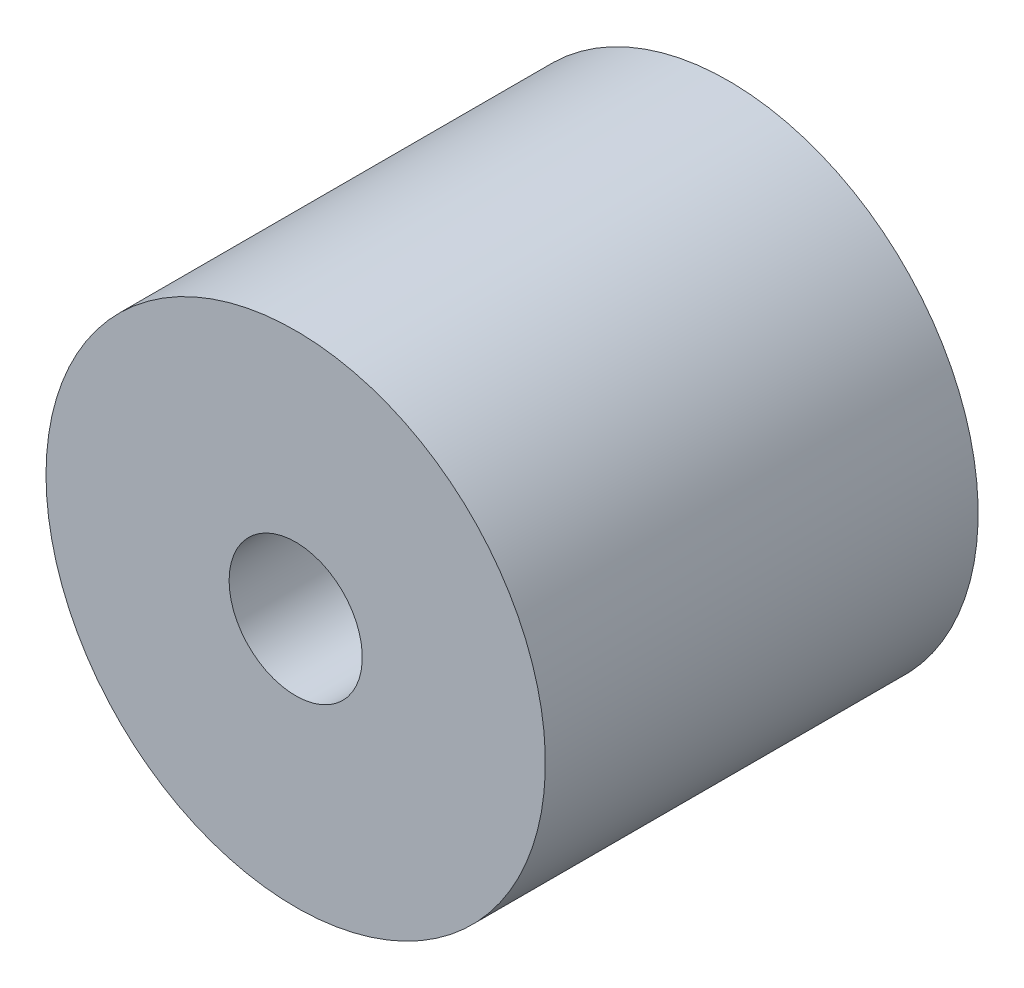
ISO-10303-21;
HEADER;
FILE_DESCRIPTION(('STEP AP214'),'2;1');
FILE_NAME('part.step','',(''),(''),'','','');
FILE_SCHEMA(('AUTOMOTIVE_DESIGN { 1 0 10303 214 1 1 1 1 }'));
ENDSEC;
DATA;
#1=APPLICATION_CONTEXT('core data for automotive mechanical design processes');
#2=APPLICATION_PROTOCOL_DEFINITION('international standard','automotive_design',2000,#1);
#3=PRODUCT_CONTEXT('',#1,'mechanical');
#4=PRODUCT('Part','Part','',(#3));
#5=PRODUCT_RELATED_PRODUCT_CATEGORY('part','',(#4));
#6=PRODUCT_DEFINITION_FORMATION('','',#4);
#7=PRODUCT_DEFINITION_CONTEXT('part definition',#1,'design');
#8=PRODUCT_DEFINITION('design','',#6,#7);
#9=PRODUCT_DEFINITION_SHAPE('','',#8);
#10=(LENGTH_UNIT() NAMED_UNIT(*) SI_UNIT(.MILLI.,.METRE.));
#11=(NAMED_UNIT(*) PLANE_ANGLE_UNIT() SI_UNIT($,.RADIAN.));
#12=(NAMED_UNIT(*) SI_UNIT($,.STERADIAN.) SOLID_ANGLE_UNIT());
#13=UNCERTAINTY_MEASURE_WITH_UNIT(LENGTH_MEASURE(1.E-05),#10,'distance_accuracy_value','');
#14=(GEOMETRIC_REPRESENTATION_CONTEXT(3) GLOBAL_UNCERTAINTY_ASSIGNED_CONTEXT((#13)) GLOBAL_UNIT_ASSIGNED_CONTEXT((#10,
#11,#12)) REPRESENTATION_CONTEXT('',''));
#15=CARTESIAN_POINT('',(0.,0.,0.));
#16=DIRECTION('',(0.,0.,1.));
#17=DIRECTION('',(1.,0.,0.));
#18=AXIS2_PLACEMENT_3D('',#15,#16,#17);
#19=CARTESIAN_POINT('',(0.,0.,26.));
#20=DIRECTION('',(0.,0.,1.));
#21=DIRECTION('',(1.,0.,0.));
#22=AXIS2_PLACEMENT_3D('',#19,#20,#21);
#23=PLANE('',#22);
#24=CARTESIAN_POINT('',(0.,0.,26.));
#25=DIRECTION('',(0.,0.,1.));
#26=DIRECTION('',(1.,0.,0.));
#27=AXIS2_PLACEMENT_3D('',#24,#25,#26);
#28=CIRCLE('',#27,15.);
#29=CARTESIAN_POINT('',(-15.,0.,26.));
#30=VERTEX_POINT('',#29);
#31=EDGE_CURVE('E10',#30,#30,#28,.T.);
#32=ORIENTED_EDGE('',*,*,#31,.T.);
#33=EDGE_LOOP('',(#32));
#34=FACE_BOUND('',#33,.T.);
#35=CARTESIAN_POINT('',(0.,0.,26.));
#36=DIRECTION('',(0.,0.,1.));
#37=DIRECTION('',(1.,0.,0.));
#38=AXIS2_PLACEMENT_3D('',#35,#36,#37);
#39=CIRCLE('',#38,4.);
#40=CARTESIAN_POINT('',(-4.,0.,26.));
#41=VERTEX_POINT('',#40);
#42=EDGE_CURVE('E42',#41,#41,#39,.T.);
#43=ORIENTED_EDGE('',*,*,#42,.F.);
#44=EDGE_LOOP('',(#43));
#45=FACE_BOUND('',#44,.T.);
#46=ADVANCED_FACE('F31',(#34,#45),#23,.T.);
#47=CARTESIAN_POINT('',(0.,0.,0.));
#48=DIRECTION('',(0.,0.,1.));
#49=DIRECTION('',(1.,0.,0.));
#50=AXIS2_PLACEMENT_3D('',#47,#48,#49);
#51=PLANE('',#50);
#52=CARTESIAN_POINT('',(0.,0.,0.));
#53=DIRECTION('',(0.,0.,1.));
#54=DIRECTION('',(1.,0.,0.));
#55=AXIS2_PLACEMENT_3D('',#52,#53,#54);
#56=CIRCLE('',#55,15.);
#57=CARTESIAN_POINT('',(-15.,0.,0.));
#58=VERTEX_POINT('',#57);
#59=EDGE_CURVE('E35',#58,#58,#56,.T.);
#60=ORIENTED_EDGE('',*,*,#59,.F.);
#61=EDGE_LOOP('',(#60));
#62=FACE_BOUND('',#61,.T.);
#63=CARTESIAN_POINT('',(0.,0.,0.));
#64=DIRECTION('',(0.,0.,1.));
#65=DIRECTION('',(1.,0.,0.));
#66=AXIS2_PLACEMENT_3D('',#63,#64,#65);
#67=CIRCLE('',#66,4.);
#68=CARTESIAN_POINT('',(-4.,0.,0.));
#69=VERTEX_POINT('',#68);
#70=EDGE_CURVE('E44',#69,#69,#67,.T.);
#71=ORIENTED_EDGE('',*,*,#70,.T.);
#72=EDGE_LOOP('',(#71));
#73=FACE_BOUND('',#72,.T.);
#74=ADVANCED_FACE('F54',(#62,#73),#51,.F.);
#75=CARTESIAN_POINT('',(0.,0.,26.));
#76=DIRECTION('',(0.,0.,-1.));
#77=DIRECTION('',(-1.,0.,0.));
#78=AXIS2_PLACEMENT_3D('',#75,#76,#77);
#79=CYLINDRICAL_SURFACE('',#78,15.);
#80=CARTESIAN_POINT('',(-15.,0.,26.));
#81=CARTESIAN_POINT('',(-15.,0.,25.7291666666667));
#82=CARTESIAN_POINT('',(-15.,0.,25.4583333333333));
#83=CARTESIAN_POINT('',(-15.,0.,24.9166666666667));
#84=CARTESIAN_POINT('',(-15.,0.,24.6458333333333));
#85=CARTESIAN_POINT('',(-15.,0.,24.1041666666667));
#86=CARTESIAN_POINT('',(-15.,0.,23.8333333333333));
#87=CARTESIAN_POINT('',(-15.,0.,23.2916666666667));
#88=CARTESIAN_POINT('',(-15.,0.,23.0208333333333));
#89=CARTESIAN_POINT('',(-15.,0.,22.4791666666667));
#90=CARTESIAN_POINT('',(-15.,0.,22.2083333333333));
#91=CARTESIAN_POINT('',(-15.,0.,21.6666666666667));
#92=CARTESIAN_POINT('',(-15.,0.,21.3958333333333));
#93=CARTESIAN_POINT('',(-15.,0.,20.8541666666667));
#94=CARTESIAN_POINT('',(-15.,0.,20.5833333333333));
#95=CARTESIAN_POINT('',(-15.,0.,20.0416666666667));
#96=CARTESIAN_POINT('',(-15.,0.,19.7708333333333));
#97=CARTESIAN_POINT('',(-15.,0.,19.2291666666667));
#98=CARTESIAN_POINT('',(-15.,0.,18.9583333333333));
#99=CARTESIAN_POINT('',(-15.,0.,18.4166666666667));
#100=CARTESIAN_POINT('',(-15.,0.,18.1458333333333));
#101=CARTESIAN_POINT('',(-15.,0.,17.6041666666667));
#102=CARTESIAN_POINT('',(-15.,0.,17.3333333333333));
#103=CARTESIAN_POINT('',(-15.,0.,16.7916666666667));
#104=CARTESIAN_POINT('',(-15.,0.,16.5208333333333));
#105=CARTESIAN_POINT('',(-15.,0.,15.9791666666667));
#106=CARTESIAN_POINT('',(-15.,0.,15.7083333333333));
#107=CARTESIAN_POINT('',(-15.,0.,15.1666666666667));
#108=CARTESIAN_POINT('',(-15.,0.,14.8958333333333));
#109=CARTESIAN_POINT('',(-15.,0.,14.3541666666667));
#110=CARTESIAN_POINT('',(-15.,0.,14.0833333333333));
#111=CARTESIAN_POINT('',(-15.,0.,13.5416666666667));
#112=CARTESIAN_POINT('',(-15.,0.,13.2708333333333));
#113=CARTESIAN_POINT('',(-15.,0.,12.7291666666667));
#114=CARTESIAN_POINT('',(-15.,0.,12.4583333333333));
#115=CARTESIAN_POINT('',(-15.,0.,11.9166666666667));
#116=CARTESIAN_POINT('',(-15.,0.,11.6458333333333));
#117=CARTESIAN_POINT('',(-15.,0.,11.1041666666667));
#118=CARTESIAN_POINT('',(-15.,0.,10.8333333333333));
#119=CARTESIAN_POINT('',(-15.,0.,10.2916666666667));
#120=CARTESIAN_POINT('',(-15.,0.,10.0208333333333));
#121=CARTESIAN_POINT('',(-15.,0.,9.47916666666667));
#122=CARTESIAN_POINT('',(-15.,0.,9.20833333333333));
#123=CARTESIAN_POINT('',(-15.,0.,8.66666666666667));
#124=CARTESIAN_POINT('',(-15.,0.,8.39583333333333));
#125=CARTESIAN_POINT('',(-15.,0.,7.85416666666667));
#126=CARTESIAN_POINT('',(-15.,0.,7.58333333333333));
#127=CARTESIAN_POINT('',(-15.,0.,7.04166666666667));
#128=CARTESIAN_POINT('',(-15.,0.,6.77083333333333));
#129=CARTESIAN_POINT('',(-15.,0.,6.22916666666667));
#130=CARTESIAN_POINT('',(-15.,0.,5.95833333333333));
#131=CARTESIAN_POINT('',(-15.,0.,5.41666666666667));
#132=CARTESIAN_POINT('',(-15.,0.,5.14583333333333));
#133=CARTESIAN_POINT('',(-15.,0.,4.60416666666667));
#134=CARTESIAN_POINT('',(-15.,0.,4.33333333333333));
#135=CARTESIAN_POINT('',(-15.,0.,3.79166666666667));
#136=CARTESIAN_POINT('',(-15.,0.,3.52083333333333));
#137=CARTESIAN_POINT('',(-15.,0.,2.97916666666667));
#138=CARTESIAN_POINT('',(-15.,0.,2.70833333333333));
#139=CARTESIAN_POINT('',(-15.,0.,2.16666666666667));
#140=CARTESIAN_POINT('',(-15.,0.,1.89583333333333));
#141=CARTESIAN_POINT('',(-15.,0.,1.35416666666667));
#142=CARTESIAN_POINT('',(-15.,0.,1.08333333333333));
#143=CARTESIAN_POINT('',(-15.,0.,0.541666666666667));
#144=CARTESIAN_POINT('',(-15.,0.,0.270833333333334));
#145=CARTESIAN_POINT('',(-15.,0.,0.));
#146=B_SPLINE_CURVE_WITH_KNOTS('',3,(#80,#81,#82,#83,#84,#85,#86,#87,#88,#89,#90,#91,#92,#93,
#94,#95,#96,#97,#98,#99,#100,#101,#102,#103,#104,#105,#106,#107,#108,#109,#110,#111,#112,#113,
#114,#115,#116,#117,#118,#119,#120,#121,#122,#123,#124,#125,#126,#127,#128,#129,#130,#131,#132,
#133,#134,#135,#136,#137,#138,#139,#140,#141,#142,#143,#144,#145),.UNSPECIFIED.,.F.,.F.,(4,2,2,
2,2,2,2,2,2,2,2,2,2,2,2,2,2,2,2,2,2,2,2,2,2,2,2,2,2,2,2,2,4),(0.,0.812500000000001,1.625,2.4375,
3.25,4.0625,4.875,5.6875,6.5,7.3125,8.125,8.9375,9.75,10.5625,11.375,12.1875,13.,13.8125,14.625,
15.4375,16.25,17.0625,17.875,18.6875,19.5,20.3125,21.125,21.9375,22.75,23.5625,24.375,25.1875,
26.),.UNSPECIFIED.);
#147=EDGE_CURVE('BSEAM33',#30,#58,#146,.T.);
#148=ORIENTED_EDGE('',*,*,#31,.F.);
#149=ORIENTED_EDGE('',*,*,#59,.T.);
#150=ORIENTED_EDGE('',*,*,#147,.T.);
#151=ORIENTED_EDGE('',*,*,#147,.F.);
#152=EDGE_LOOP('',(#148,#150,#149,#151));
#153=FACE_BOUND('',#152,.T.);
#154=ADVANCED_FACE('F33',(#153),#79,.T.);
#155=CARTESIAN_POINT('',(0.,0.,26.));
#156=DIRECTION('',(0.,0.,-1.));
#157=DIRECTION('',(-1.,0.,0.));
#158=AXIS2_PLACEMENT_3D('',#155,#156,#157);
#159=CYLINDRICAL_SURFACE('',#158,4.);
#160=CARTESIAN_POINT('',(-4.,0.,26.));
#161=CARTESIAN_POINT('',(-4.,0.,25.7291666666667));
#162=CARTESIAN_POINT('',(-4.,0.,25.4583333333333));
#163=CARTESIAN_POINT('',(-4.,0.,24.9166666666667));
#164=CARTESIAN_POINT('',(-4.,0.,24.6458333333333));
#165=CARTESIAN_POINT('',(-4.,0.,24.1041666666667));
#166=CARTESIAN_POINT('',(-4.,0.,23.8333333333333));
#167=CARTESIAN_POINT('',(-4.,0.,23.2916666666667));
#168=CARTESIAN_POINT('',(-4.,0.,23.0208333333333));
#169=CARTESIAN_POINT('',(-4.,0.,22.4791666666667));
#170=CARTESIAN_POINT('',(-4.,0.,22.2083333333333));
#171=CARTESIAN_POINT('',(-4.,0.,21.6666666666667));
#172=CARTESIAN_POINT('',(-4.,0.,21.3958333333333));
#173=CARTESIAN_POINT('',(-4.,0.,20.8541666666667));
#174=CARTESIAN_POINT('',(-4.,0.,20.5833333333333));
#175=CARTESIAN_POINT('',(-4.,0.,20.0416666666667));
#176=CARTESIAN_POINT('',(-4.,0.,19.7708333333333));
#177=CARTESIAN_POINT('',(-4.,0.,19.2291666666667));
#178=CARTESIAN_POINT('',(-4.,0.,18.9583333333333));
#179=CARTESIAN_POINT('',(-4.,0.,18.4166666666667));
#180=CARTESIAN_POINT('',(-4.,0.,18.1458333333333));
#181=CARTESIAN_POINT('',(-4.,0.,17.6041666666667));
#182=CARTESIAN_POINT('',(-4.,0.,17.3333333333333));
#183=CARTESIAN_POINT('',(-4.,0.,16.7916666666667));
#184=CARTESIAN_POINT('',(-4.,0.,16.5208333333333));
#185=CARTESIAN_POINT('',(-4.,0.,15.9791666666667));
#186=CARTESIAN_POINT('',(-4.,0.,15.7083333333333));
#187=CARTESIAN_POINT('',(-4.,0.,15.1666666666667));
#188=CARTESIAN_POINT('',(-4.,0.,14.8958333333333));
#189=CARTESIAN_POINT('',(-4.,0.,14.3541666666667));
#190=CARTESIAN_POINT('',(-4.,0.,14.0833333333333));
#191=CARTESIAN_POINT('',(-4.,0.,13.5416666666667));
#192=CARTESIAN_POINT('',(-4.,0.,13.2708333333333));
#193=CARTESIAN_POINT('',(-4.,0.,12.7291666666667));
#194=CARTESIAN_POINT('',(-4.,0.,12.4583333333333));
#195=CARTESIAN_POINT('',(-4.,0.,11.9166666666667));
#196=CARTESIAN_POINT('',(-4.,0.,11.6458333333333));
#197=CARTESIAN_POINT('',(-4.,0.,11.1041666666667));
#198=CARTESIAN_POINT('',(-4.,0.,10.8333333333333));
#199=CARTESIAN_POINT('',(-4.,0.,10.2916666666667));
#200=CARTESIAN_POINT('',(-4.,0.,10.0208333333333));
#201=CARTESIAN_POINT('',(-4.,0.,9.47916666666667));
#202=CARTESIAN_POINT('',(-4.,0.,9.20833333333333));
#203=CARTESIAN_POINT('',(-4.,0.,8.66666666666667));
#204=CARTESIAN_POINT('',(-4.,0.,8.39583333333333));
#205=CARTESIAN_POINT('',(-4.,0.,7.85416666666667));
#206=CARTESIAN_POINT('',(-4.,0.,7.58333333333333));
#207=CARTESIAN_POINT('',(-4.,0.,7.04166666666667));
#208=CARTESIAN_POINT('',(-4.,0.,6.77083333333333));
#209=CARTESIAN_POINT('',(-4.,0.,6.22916666666667));
#210=CARTESIAN_POINT('',(-4.,0.,5.95833333333333));
#211=CARTESIAN_POINT('',(-4.,0.,5.41666666666667));
#212=CARTESIAN_POINT('',(-4.,0.,5.14583333333333));
#213=CARTESIAN_POINT('',(-4.,0.,4.60416666666667));
#214=CARTESIAN_POINT('',(-4.,0.,4.33333333333333));
#215=CARTESIAN_POINT('',(-4.,0.,3.79166666666667));
#216=CARTESIAN_POINT('',(-4.,0.,3.52083333333333));
#217=CARTESIAN_POINT('',(-4.,0.,2.97916666666667));
#218=CARTESIAN_POINT('',(-4.,0.,2.70833333333333));
#219=CARTESIAN_POINT('',(-4.,0.,2.16666666666667));
#220=CARTESIAN_POINT('',(-4.,0.,1.89583333333333));
#221=CARTESIAN_POINT('',(-4.,0.,1.35416666666667));
#222=CARTESIAN_POINT('',(-4.,0.,1.08333333333333));
#223=CARTESIAN_POINT('',(-4.,0.,0.541666666666667));
#224=CARTESIAN_POINT('',(-4.,0.,0.270833333333334));
#225=CARTESIAN_POINT('',(-4.,0.,0.));
#226=B_SPLINE_CURVE_WITH_KNOTS('',3,(#160,#161,#162,#163,#164,#165,#166,#167,#168,#169,#170,
#171,#172,#173,#174,#175,#176,#177,#178,#179,#180,#181,#182,#183,#184,#185,#186,#187,#188,#189,
#190,#191,#192,#193,#194,#195,#196,#197,#198,#199,#200,#201,#202,#203,#204,#205,#206,#207,#208,
#209,#210,#211,#212,#213,#214,#215,#216,#217,#218,#219,#220,#221,#222,#223,#224,#225),
.UNSPECIFIED.,.F.,.F.,(4,2,2,2,2,2,2,2,2,2,2,2,2,2,2,2,2,2,2,2,2,2,2,2,2,2,2,2,2,2,2,2,4),(0.,
0.812500000000001,1.625,2.4375,3.25,4.0625,4.875,5.6875,6.5,7.3125,8.125,8.9375,9.75,10.5625,
11.375,12.1875,13.,13.8125,14.625,15.4375,16.25,17.0625,17.875,18.6875,19.5,20.3125,21.125,
21.9375,22.75,23.5625,24.375,25.1875,26.),.UNSPECIFIED.);
#227=EDGE_CURVE('BSEAM50',#41,#69,#226,.T.);
#228=ORIENTED_EDGE('',*,*,#42,.T.);
#229=ORIENTED_EDGE('',*,*,#70,.F.);
#230=ORIENTED_EDGE('',*,*,#227,.T.);
#231=ORIENTED_EDGE('',*,*,#227,.F.);
#232=EDGE_LOOP('',(#228,#230,#229,#231));
#233=FACE_BOUND('',#232,.T.);
#234=ADVANCED_FACE('F50',(#233),#159,.F.);
#235=CLOSED_SHELL('',(#46,#74,#154,#234));
#236=MANIFOLD_SOLID_BREP('B2',#235);
#237=ADVANCED_BREP_SHAPE_REPRESENTATION('',(#18,#236),#14);
#238=SHAPE_DEFINITION_REPRESENTATION(#9,#237);
ENDSEC;
END-ISO-10303-21;
